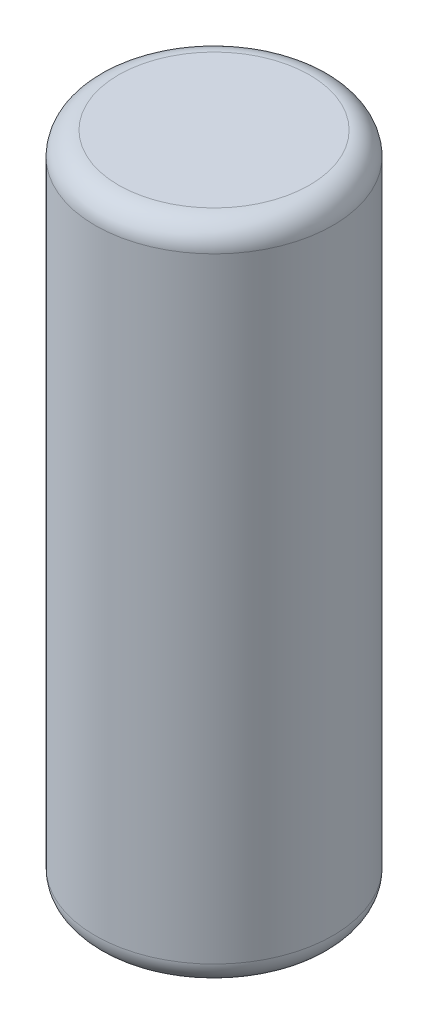
ISO-10303-21;
HEADER;
FILE_DESCRIPTION(('STEP AP214'),'2;1');
FILE_NAME('part.step','',(''),(''),'','','');
FILE_SCHEMA(('AUTOMOTIVE_DESIGN { 1 0 10303 214 1 1 1 1 }'));
ENDSEC;
DATA;
#1=APPLICATION_CONTEXT('core data for automotive mechanical design processes');
#2=APPLICATION_PROTOCOL_DEFINITION('international standard','automotive_design',2000,#1);
#3=PRODUCT_CONTEXT('',#1,'mechanical');
#4=PRODUCT('Part','Part','',(#3));
#5=PRODUCT_RELATED_PRODUCT_CATEGORY('part','',(#4));
#6=PRODUCT_DEFINITION_FORMATION('','',#4);
#7=PRODUCT_DEFINITION_CONTEXT('part definition',#1,'design');
#8=PRODUCT_DEFINITION('design','',#6,#7);
#9=PRODUCT_DEFINITION_SHAPE('','',#8);
#10=(LENGTH_UNIT() NAMED_UNIT(*) SI_UNIT(.MILLI.,.METRE.));
#11=(NAMED_UNIT(*) PLANE_ANGLE_UNIT() SI_UNIT($,.RADIAN.));
#12=(NAMED_UNIT(*) SI_UNIT($,.STERADIAN.) SOLID_ANGLE_UNIT());
#13=UNCERTAINTY_MEASURE_WITH_UNIT(LENGTH_MEASURE(1.E-05),#10,'distance_accuracy_value','');
#14=(GEOMETRIC_REPRESENTATION_CONTEXT(3) GLOBAL_UNCERTAINTY_ASSIGNED_CONTEXT((#13)) GLOBAL_UNIT_ASSIGNED_CONTEXT((#10,
#11,#12)) REPRESENTATION_CONTEXT('',''));
#15=CARTESIAN_POINT('',(0.,0.,0.));
#16=DIRECTION('',(0.,0.,1.));
#17=DIRECTION('',(1.,0.,0.));
#18=AXIS2_PLACEMENT_3D('',#15,#16,#17);
#19=CARTESIAN_POINT('',(0.,284.,0.));
#20=DIRECTION('',(0.,-1.,0.));
#21=DIRECTION('',(0.,0.,-1.));
#22=AXIS2_PLACEMENT_3D('',#19,#20,#21);
#23=CYLINDRICAL_SURFACE('',#22,51.);
#24=CARTESIAN_POINT('',(0.,10.,0.));
#25=DIRECTION('',(0.,1.,0.));
#26=DIRECTION('',(0.,0.,1.));
#27=AXIS2_PLACEMENT_3D('',#24,#25,#26);
#28=CIRCLE('',#27,51.);
#29=CARTESIAN_POINT('',(0.,10.,51.));
#30=VERTEX_POINT('',#29);
#31=EDGE_CURVE('E44',#30,#30,#28,.T.);
#32=ORIENTED_EDGE('',*,*,#31,.T.);
#33=EDGE_LOOP('',(#32));
#34=FACE_BOUND('',#33,.T.);
#35=CARTESIAN_POINT('',(0.,274.,0.));
#36=DIRECTION('',(0.,1.,0.));
#37=DIRECTION('',(0.,0.,1.));
#38=AXIS2_PLACEMENT_3D('',#35,#36,#37);
#39=CIRCLE('',#38,51.);
#40=CARTESIAN_POINT('',(0.,274.,51.));
#41=VERTEX_POINT('',#40);
#42=EDGE_CURVE('E48',#41,#41,#39,.F.);
#43=ORIENTED_EDGE('',*,*,#42,.T.);
#44=EDGE_LOOP('',(#43));
#45=FACE_BOUND('',#44,.T.);
#46=ADVANCED_FACE('F33',(#34,#45),#23,.T.);
#47=CARTESIAN_POINT('',(0.,284.,0.));
#48=DIRECTION('',(0.,1.,0.));
#49=DIRECTION('',(0.,0.,1.));
#50=AXIS2_PLACEMENT_3D('',#47,#48,#49);
#51=PLANE('',#50);
#52=CARTESIAN_POINT('',(0.,284.,0.));
#53=DIRECTION('',(0.,1.,0.));
#54=DIRECTION('',(0.,0.,1.));
#55=AXIS2_PLACEMENT_3D('',#52,#53,#54);
#56=CIRCLE('',#55,41.);
#57=CARTESIAN_POINT('',(0.,284.,41.));
#58=VERTEX_POINT('',#57);
#59=EDGE_CURVE('E10',#58,#58,#56,.T.);
#60=ORIENTED_EDGE('',*,*,#59,.T.);
#61=EDGE_LOOP('',(#60));
#62=FACE_BOUND('',#61,.T.);
#63=ADVANCED_FACE('F64',(#62),#51,.T.);
#64=CARTESIAN_POINT('',(0.,0.,0.));
#65=DIRECTION('',(0.,1.,0.));
#66=DIRECTION('',(0.,0.,1.));
#67=AXIS2_PLACEMENT_3D('',#64,#65,#66);
#68=PLANE('',#67);
#69=CARTESIAN_POINT('',(0.,0.,0.));
#70=DIRECTION('',(0.,1.,0.));
#71=DIRECTION('',(0.,0.,1.));
#72=AXIS2_PLACEMENT_3D('',#69,#70,#71);
#73=CIRCLE('',#72,41.);
#74=CARTESIAN_POINT('',(0.,0.,41.));
#75=VERTEX_POINT('',#74);
#76=EDGE_CURVE('E40',#75,#75,#73,.F.);
#77=ORIENTED_EDGE('',*,*,#76,.T.);
#78=EDGE_LOOP('',(#77));
#79=FACE_BOUND('',#78,.T.);
#80=ADVANCED_FACE('F61',(#79),#68,.F.);
#81=CARTESIAN_POINT('',(0.,10.,0.));
#82=DIRECTION('',(0.,1.,0.));
#83=DIRECTION('',(0.,0.,1.));
#84=AXIS2_PLACEMENT_3D('',#81,#82,#83);
#85=TOROIDAL_SURFACE('',#84,41.,10.);
#86=ORIENTED_EDGE('',*,*,#76,.F.);
#87=EDGE_LOOP('',(#86));
#88=FACE_BOUND('',#87,.T.);
#89=ORIENTED_EDGE('',*,*,#31,.F.);
#90=EDGE_LOOP('',(#89));
#91=FACE_BOUND('',#90,.T.);
#92=ADVANCED_FACE('F57',(#88,#91),#85,.T.);
#93=CARTESIAN_POINT('',(0.,274.,0.));
#94=DIRECTION('',(0.,1.,0.));
#95=DIRECTION('',(0.,0.,1.));
#96=AXIS2_PLACEMENT_3D('',#93,#94,#95);
#97=TOROIDAL_SURFACE('',#96,41.,10.);
#98=ORIENTED_EDGE('',*,*,#42,.F.);
#99=EDGE_LOOP('',(#98));
#100=FACE_BOUND('',#99,.T.);
#101=ORIENTED_EDGE('',*,*,#59,.F.);
#102=EDGE_LOOP('',(#101));
#103=FACE_BOUND('',#102,.T.);
#104=ADVANCED_FACE('F35',(#100,#103),#97,.T.);
#105=CLOSED_SHELL('',(#46,#63,#80,#92,#104));
#106=MANIFOLD_SOLID_BREP('B2',#105);
#107=ADVANCED_BREP_SHAPE_REPRESENTATION('',(#18,#106),#14);
#108=SHAPE_DEFINITION_REPRESENTATION(#9,#107);
ENDSEC;
END-ISO-10303-21;
